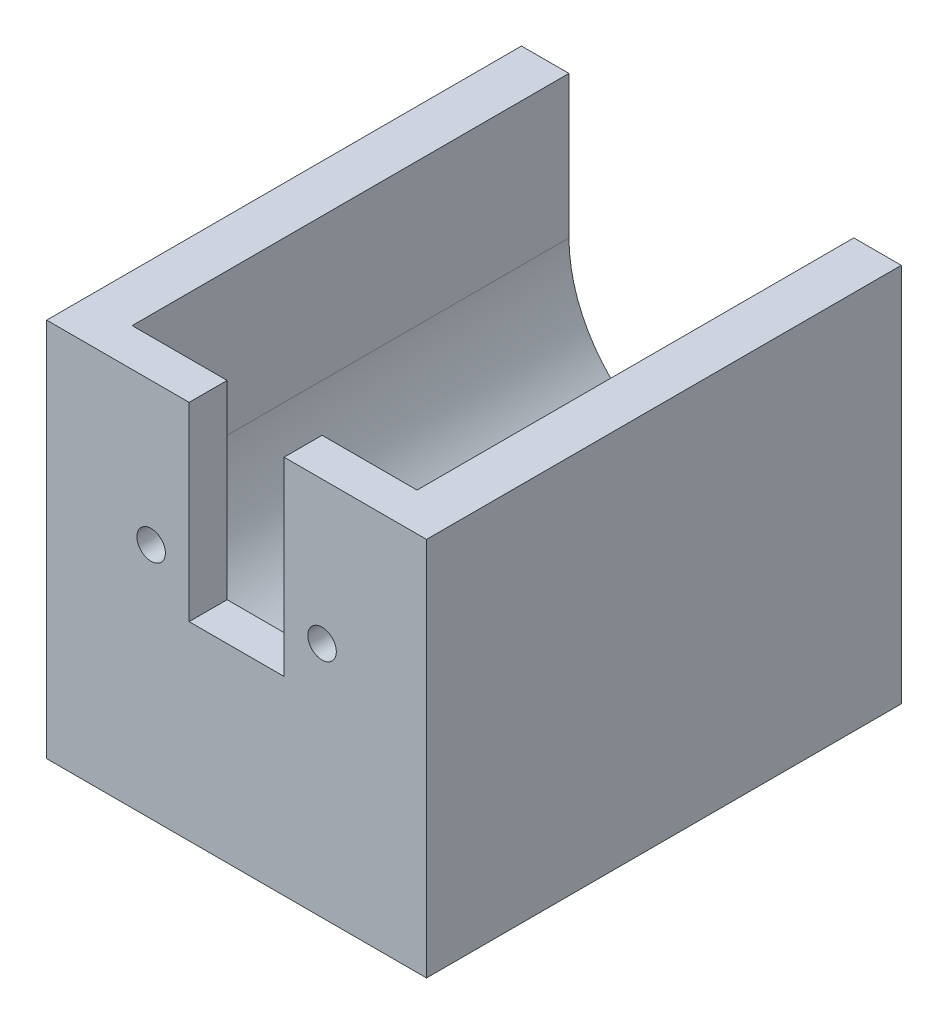
ISO-10303-21;
HEADER;
FILE_DESCRIPTION(('STEP AP214'),'2;1');
FILE_NAME('part.step','',(''),(''),'','','');
FILE_SCHEMA(('AUTOMOTIVE_DESIGN { 1 0 10303 214 1 1 1 1 }'));
ENDSEC;
DATA;
#1=APPLICATION_CONTEXT('core data for automotive mechanical design processes');
#2=APPLICATION_PROTOCOL_DEFINITION('international standard','automotive_design',2000,#1);
#3=PRODUCT_CONTEXT('',#1,'mechanical');
#4=PRODUCT('Part','Part','',(#3));
#5=PRODUCT_RELATED_PRODUCT_CATEGORY('part','',(#4));
#6=PRODUCT_DEFINITION_FORMATION('','',#4);
#7=PRODUCT_DEFINITION_CONTEXT('part definition',#1,'design');
#8=PRODUCT_DEFINITION('design','',#6,#7);
#9=PRODUCT_DEFINITION_SHAPE('','',#8);
#10=(LENGTH_UNIT() NAMED_UNIT(*) SI_UNIT(.MILLI.,.METRE.));
#11=(NAMED_UNIT(*) PLANE_ANGLE_UNIT() SI_UNIT($,.RADIAN.));
#12=(NAMED_UNIT(*) SI_UNIT($,.STERADIAN.) SOLID_ANGLE_UNIT());
#13=UNCERTAINTY_MEASURE_WITH_UNIT(LENGTH_MEASURE(1.E-05),#10,'distance_accuracy_value','');
#14=(GEOMETRIC_REPRESENTATION_CONTEXT(3) GLOBAL_UNCERTAINTY_ASSIGNED_CONTEXT((#13)) GLOBAL_UNIT_ASSIGNED_CONTEXT((#10,
#11,#12)) REPRESENTATION_CONTEXT('',''));
#15=CARTESIAN_POINT('',(0.,0.,0.));
#16=DIRECTION('',(0.,0.,1.));
#17=DIRECTION('',(1.,0.,0.));
#18=AXIS2_PLACEMENT_3D('',#15,#16,#17);
#19=CARTESIAN_POINT('',(10.,12.5,-32.));
#20=DIRECTION('',(0.,0.,1.));
#21=DIRECTION('',(1.,0.,0.));
#22=AXIS2_PLACEMENT_3D('',#19,#20,#21);
#23=CYLINDRICAL_SURFACE('',#22,7.5);
#24=CARTESIAN_POINT('',(10.,5.,-16.));
#25=CARTESIAN_POINT('',(9.91933679906047,5.00000111029528,-16.0000016109771));
#26=CARTESIAN_POINT('',(9.83864558650163,5.0013063104993,-16.00325988452));
#27=CARTESIAN_POINT('',(9.67785390547775,5.00648813823474,-16.0162529045329));
#28=CARTESIAN_POINT('',(9.59775384201802,5.01036638825381,-16.0259917374599));
#29=CARTESIAN_POINT('',(9.35890321893255,5.02575365191243,-16.0648711401178));
#30=CARTESIAN_POINT('',(9.20184191747828,5.04101477733758,-16.1036743075448));
#31=CARTESIAN_POINT('',(8.89752966100119,5.07988540873016,-16.2053142278109));
#32=CARTESIAN_POINT('',(8.75024842246924,5.10346756470325,-16.2680722990302));
#33=CARTESIAN_POINT('',(8.46840262594203,5.1566512277593,-16.415528730295));
#34=CARTESIAN_POINT('',(8.33383367572509,5.18625064459534,-16.5002194742658));
#35=CARTESIAN_POINT('',(8.07474547367278,5.25003659640635,-16.6933532563024));
#36=CARTESIAN_POINT('',(7.95090578196832,5.2843655162606,-16.8026599866313));
#37=CARTESIAN_POINT('',(7.72273830242395,5.35309137622315,-17.0401000029431));
#38=CARTESIAN_POINT('',(7.61842006058024,5.38748834134079,-17.1682424451965));
#39=CARTESIAN_POINT('',(7.4276879179321,5.45415811453267,-17.4466421060122));
#40=CARTESIAN_POINT('',(7.34227746638662,5.48626825825615,-17.5976297292088));
#41=CARTESIAN_POINT('',(7.19836798323504,5.54249529446661,-17.9133045974561));
#42=CARTESIAN_POINT('',(7.13985616976676,5.56661598190703,-18.0779852917251));
#43=CARTESIAN_POINT('',(7.05415174944522,5.6026046345439,-18.4085685004335));
#44=CARTESIAN_POINT('',(7.025659047163,5.61497869460735,-18.5740768533829));
#45=CARTESIAN_POINT('',(6.99674056166646,5.62753993932139,-18.9079524974424));
#46=CARTESIAN_POINT('',(6.99630097658633,5.62773311684932,-19.0763183419086));
#47=CARTESIAN_POINT('',(7.02251594776144,5.61634249608732,-19.3986350072253));
#48=CARTESIAN_POINT('',(7.04728702832417,5.60557737558287,-19.5527735717239));
#49=CARTESIAN_POINT('',(7.12007967986763,5.57485718705799,-19.8544893341131));
#50=CARTESIAN_POINT('',(7.16810530787593,5.55490051549373,-20.0020653821892));
#51=CARTESIAN_POINT('',(7.28695790108488,5.50760772334829,-20.2900267542603));
#52=CARTESIAN_POINT('',(7.35823020650324,5.4801293107012,-20.430203858573));
#53=CARTESIAN_POINT('',(7.52124030892547,5.42092825423867,-20.6971237245514));
#54=CARTESIAN_POINT('',(7.61298579235533,5.38920401817139,-20.8238614141067));
#55=CARTESIAN_POINT('',(7.82267410081125,5.32209894883995,-21.0706145932003));
#56=CARTESIAN_POINT('',(7.94209380554214,5.28662502535076,-21.1893530941683));
#57=CARTESIAN_POINT('',(8.19952835885662,5.21810262563274,-21.4055267170038));
#58=CARTESIAN_POINT('',(8.33754690199887,5.18505463332201,-21.5029575961156));
#59=CARTESIAN_POINT('',(8.63188352109071,5.12427978102985,-21.6754261711236));
#60=CARTESIAN_POINT('',(8.78850926298015,5.09667094856827,-21.7499834217955));
#61=CARTESIAN_POINT('',(9.11346435177582,5.05077757506913,-21.8712517916171));
#62=CARTESIAN_POINT('',(9.28178770472552,5.0324882980644,-21.9179770563361));
#63=CARTESIAN_POINT('',(9.61465616858824,5.00815790739621,-21.9796724431295));
#64=CARTESIAN_POINT('',(9.77883505902171,5.00145581249726,-21.9963586813803));
#65=CARTESIAN_POINT('',(10.1077679647117,4.99897282234057,-22.0025696507929));
#66=CARTESIAN_POINT('',(10.2725218198358,5.00318909626563,-21.9921014223213));
#67=CARTESIAN_POINT('',(10.590149108683,5.0216364940437,-21.945562371172));
#68=CARTESIAN_POINT('',(10.7432237376634,5.03540912981717,-21.9106630294736));
#69=CARTESIAN_POINT('',(11.0412031420909,5.07110837891748,-21.8178464375352));
#70=CARTESIAN_POINT('',(11.1861068653364,5.09303603965197,-21.7599262304967));
#71=CARTESIAN_POINT('',(11.4686181787259,5.1437510784379,-21.6208225904804));
#72=CARTESIAN_POINT('',(11.6058670341364,5.17272776030323,-21.5389817919364));
#73=CARTESIAN_POINT('',(11.8651653868666,5.23439952881684,-21.3550895141405));
#74=CARTESIAN_POINT('',(11.9872087611294,5.26709610334487,-21.253029935612));
#75=CARTESIAN_POINT('',(12.2210845645563,5.33532323542947,-21.0236949805799));
#76=CARTESIAN_POINT('',(12.3317109007594,5.37089837862861,-20.8951996877573));
#77=CARTESIAN_POINT('',(12.5301267960703,5.43887490623863,-20.6208398754693));
#78=CARTESIAN_POINT('',(12.6179125918181,5.47127576708592,-20.4749724994279));
#79=CARTESIAN_POINT('',(12.7687112530874,5.52928550140095,-20.1678074581716));
#80=CARTESIAN_POINT('',(12.831475892514,5.55482553679034,-20.006374001417));
#81=CARTESIAN_POINT('',(12.9284443288462,5.59514489776892,-19.673899522192));
#82=CARTESIAN_POINT('',(12.9626692052475,5.60993216432824,-19.5028656904034));
#83=CARTESIAN_POINT('',(12.9995734283829,5.62592361071621,-19.169308148153));
#84=CARTESIAN_POINT('',(13.0043456323476,5.62802868565341,-19.0070577435492));
#85=CARTESIAN_POINT('',(12.9877047300241,5.62077745872765,-18.6841827104912));
#86=CARTESIAN_POINT('',(12.9662949487688,5.61142261223981,-18.5235578782059));
#87=CARTESIAN_POINT('',(12.8996070810233,5.58310026658875,-18.215001725725));
#88=CARTESIAN_POINT('',(12.8553063568106,5.56452753274938,-18.0668196268388));
#89=CARTESIAN_POINT('',(12.7450080562502,5.52013997134562,-17.7799320170809));
#90=CARTESIAN_POINT('',(12.6790044878915,5.49432314402415,-17.6412291361468));
#91=CARTESIAN_POINT('',(12.5228096031995,5.43652089598758,-17.3685857228138));
#92=CARTESIAN_POINT('',(12.4314497613399,5.40426691874683,-17.2353725760242));
#93=CARTESIAN_POINT('',(12.2288364197758,5.33804278092467,-16.985509442799));
#94=CARTESIAN_POINT('',(12.1175769239766,5.3040721052933,-16.8688644676868));
#95=CARTESIAN_POINT('',(11.8697652641623,5.23559710488391,-16.6476980351852));
#96=CARTESIAN_POINT('',(11.7320409344105,5.20120098056014,-16.5444529409441));
#97=CARTESIAN_POINT('',(11.4398235352366,5.13799154821058,-16.3624855306449));
#98=CARTESIAN_POINT('',(11.2853227122971,5.10918083885154,-16.2837746190438));
#99=CARTESIAN_POINT('',(11.0458904629238,5.07285172113922,-16.1869264991112));
#100=CARTESIAN_POINT('',(10.9655506423263,5.061957476294,-16.158344029876));
#101=CARTESIAN_POINT('',(10.8024720151951,5.04260376205747,-16.1080623417057));
#102=CARTESIAN_POINT('',(10.7197343470038,5.03414315751714,-16.0863599131552));
#103=CARTESIAN_POINT('',(10.5527075558774,5.01992456499654,-16.0501179690362));
#104=CARTESIAN_POINT('',(10.468422937873,5.01415972591675,-16.0355602908621));
#105=CARTESIAN_POINT('',(10.2988146089412,5.00547490593684,-16.0136963472085));
#106=CARTESIAN_POINT('',(10.2134916803117,5.00255290306599,-16.0063849277493));
#107=CARTESIAN_POINT('',(10.0853730051866,5.00036409779144,-16.0009104795947));
#108=CARTESIAN_POINT('',(10.0426904255931,4.99999941238412,-15.9999991474018));
#109=CARTESIAN_POINT('',(10.,5.,-16.));
#110=B_SPLINE_CURVE_WITH_KNOTS('',3,(#24,#25,#26,#27,#28,#29,#30,#31,#32,#33,#34,#35,#36,#37,
#38,#39,#40,#41,#42,#43,#44,#45,#46,#47,#48,#49,#50,#51,#52,#53,#54,#55,#56,#57,#58,#59,#60,#61,
#62,#63,#64,#65,#66,#67,#68,#69,#70,#71,#72,#73,#74,#75,#76,#77,#78,#79,#80,#81,#82,#83,#84,#85,
#86,#87,#88,#89,#90,#91,#92,#93,#94,#95,#96,#97,#98,#99,#100,#101,#102,#103,#104,#105,#106,#107,
#108,#109),.UNSPECIFIED.,.T.,.F.,(4,2,2,2,2,2,2,2,2,2,2,2,2,2,2,2,2,2,2,2,2,2,2,2,2,2,2,2,2,2,2,
2,2,2,2,2,2,2,2,2,2,2,4),(0.,0.241952995066615,0.484058703589862,0.968979675762158,
1.45232140795763,1.93549552527002,2.43941494725621,2.94358014576643,3.47018310403851,
3.99653556852428,4.49901580138268,5.00124881685757,5.46852914780512,5.93589103065597,
6.41279111629751,6.88987055088802,7.40382945961362,7.91789061441126,8.44210791925736,
8.96605856352212,9.45899198973538,9.9517976253665,10.4224610552807,10.8931849567222,
11.3783069227892,11.8636236142998,12.3809813411815,12.8984242574715,13.4208798989277,
13.9429493115043,14.4274493227065,14.911887810261,15.3771690000468,15.8425787588927,
16.3346362426657,16.8268422420412,17.3509605748228,17.8753221764233,18.1329380344125,
18.3904335342851,18.6472710222664,18.9039257004315,19.0319776028183),.UNSPECIFIED.);
#111=CARTESIAN_POINT('',(10.,5.,-16.));
#112=VERTEX_POINT('',#111);
#113=EDGE_CURVE('E179',#112,#112,#110,.T.);
#114=ORIENTED_EDGE('',*,*,#113,.T.);
#115=EDGE_LOOP('',(#114));
#116=FACE_BOUND('',#115,.T.);
#117=CARTESIAN_POINT('',(10.,5.,-7.));
#118=CARTESIAN_POINT('',(9.91933679906047,5.00000111029528,-7.0000016109771));
#119=CARTESIAN_POINT('',(9.83864558650163,5.0013063104993,-7.00325988452));
#120=CARTESIAN_POINT('',(9.67785390547775,5.00648813823474,-7.0162529045329));
#121=CARTESIAN_POINT('',(9.59775384201802,5.01036638825381,-7.02599173745989));
#122=CARTESIAN_POINT('',(9.35890321893255,5.02575365191243,-7.0648711401178));
#123=CARTESIAN_POINT('',(9.20184191747828,5.04101477733758,-7.10367430754479));
#124=CARTESIAN_POINT('',(8.8975296610012,5.07988540873016,-7.2053142278109));
#125=CARTESIAN_POINT('',(8.75024842246924,5.10346756470325,-7.26807229903017));
#126=CARTESIAN_POINT('',(8.46840262594204,5.1566512277593,-7.41552873029505));
#127=CARTESIAN_POINT('',(8.33383367572509,5.18625064459534,-7.50021947426577));
#128=CARTESIAN_POINT('',(8.07474547367278,5.25003659640635,-7.69335325630236));
#129=CARTESIAN_POINT('',(7.95090578196832,5.2843655162606,-7.80265998663132));
#130=CARTESIAN_POINT('',(7.72273830242395,5.35309137622316,-8.04010000294314));
#131=CARTESIAN_POINT('',(7.61842006058024,5.38748834134079,-8.1682424451965));
#132=CARTESIAN_POINT('',(7.4276879179321,5.45415811453267,-8.44664210601216));
#133=CARTESIAN_POINT('',(7.34227746638662,5.48626825825615,-8.59762972920882));
#134=CARTESIAN_POINT('',(7.19836798323504,5.54249529446661,-8.91330459745613));
#135=CARTESIAN_POINT('',(7.13985616976676,5.56661598190702,-9.0779852917251));
#136=CARTESIAN_POINT('',(7.05415174944522,5.6026046345439,-9.40856850043345));
#137=CARTESIAN_POINT('',(7.025659047163,5.61497869460735,-9.57407685338287));
#138=CARTESIAN_POINT('',(6.99674056166645,5.62753993932139,-9.90795249744237));
#139=CARTESIAN_POINT('',(6.99630097658633,5.62773311684932,-10.0763183419086));
#140=CARTESIAN_POINT('',(7.02251594776144,5.61634249608732,-10.3986350072253));
#141=CARTESIAN_POINT('',(7.04728702832417,5.60557737558286,-10.5527735717239));
#142=CARTESIAN_POINT('',(7.12007967986763,5.57485718705798,-10.8544893341131));
#143=CARTESIAN_POINT('',(7.16810530787593,5.55490051549373,-11.0020653821892));
#144=CARTESIAN_POINT('',(7.28695790108488,5.50760772334829,-11.2900267542603));
#145=CARTESIAN_POINT('',(7.35823020650324,5.4801293107012,-11.430203858573));
#146=CARTESIAN_POINT('',(7.52124030892547,5.42092825423867,-11.6971237245514));
#147=CARTESIAN_POINT('',(7.61298579235533,5.38920401817139,-11.8238614141067));
#148=CARTESIAN_POINT('',(7.82267410081124,5.32209894883995,-12.0706145932003));
#149=CARTESIAN_POINT('',(7.94209380554214,5.28662502535076,-12.1893530941683));
#150=CARTESIAN_POINT('',(8.19952835885662,5.21810262563274,-12.4055267170038));
#151=CARTESIAN_POINT('',(8.33754690199886,5.18505463332201,-12.5029575961156));
#152=CARTESIAN_POINT('',(8.63188352109071,5.12427978102985,-12.6754261711236));
#153=CARTESIAN_POINT('',(8.78850926298014,5.09667094856827,-12.7499834217955));
#154=CARTESIAN_POINT('',(9.11346435177581,5.05077757506913,-12.8712517916171));
#155=CARTESIAN_POINT('',(9.28178770472552,5.0324882980644,-12.9179770563361));
#156=CARTESIAN_POINT('',(9.61465616858824,5.00815790739621,-12.9796724431296));
#157=CARTESIAN_POINT('',(9.77883505902171,5.00145581249726,-12.9963586813803));
#158=CARTESIAN_POINT('',(10.1077679647117,4.99897282234057,-13.0025696507929));
#159=CARTESIAN_POINT('',(10.2725218198358,5.00318909626563,-12.9921014223212));
#160=CARTESIAN_POINT('',(10.590149108683,5.0216364940437,-12.945562371172));
#161=CARTESIAN_POINT('',(10.7432237376634,5.03540912981717,-12.9106630294736));
#162=CARTESIAN_POINT('',(11.0412031420909,5.07110837891748,-12.8178464375352));
#163=CARTESIAN_POINT('',(11.1861068653364,5.09303603965197,-12.7599262304967));
#164=CARTESIAN_POINT('',(11.4686181787259,5.1437510784379,-12.6208225904804));
#165=CARTESIAN_POINT('',(11.6058670341364,5.17272776030323,-12.5389817919364));
#166=CARTESIAN_POINT('',(11.8651653868666,5.23439952881684,-12.3550895141405));
#167=CARTESIAN_POINT('',(11.9872087611294,5.26709610334487,-12.253029935612));
#168=CARTESIAN_POINT('',(12.2210845645563,5.33532323542946,-12.0236949805799));
#169=CARTESIAN_POINT('',(12.3317109007594,5.37089837862861,-11.8951996877573));
#170=CARTESIAN_POINT('',(12.5301267960703,5.43887490623863,-11.6208398754693));
#171=CARTESIAN_POINT('',(12.6179125918181,5.47127576708592,-11.4749724994279));
#172=CARTESIAN_POINT('',(12.7687112530874,5.52928550140095,-11.1678074581716));
#173=CARTESIAN_POINT('',(12.831475892514,5.55482553679034,-11.006374001417));
#174=CARTESIAN_POINT('',(12.9284443288462,5.59514489776892,-10.673899522192));
#175=CARTESIAN_POINT('',(12.9626692052475,5.60993216432824,-10.5028656904034));
#176=CARTESIAN_POINT('',(12.9995734283829,5.62592361071621,-10.169308148153));
#177=CARTESIAN_POINT('',(13.0043456323476,5.62802868565341,-10.0070577435492));
#178=CARTESIAN_POINT('',(12.9877047300241,5.62077745872765,-9.68418271049118));
#179=CARTESIAN_POINT('',(12.9662949487688,5.61142261223982,-9.52355787820591));
#180=CARTESIAN_POINT('',(12.8996070810233,5.58310026658875,-9.21500172572503));
#181=CARTESIAN_POINT('',(12.8553063568106,5.56452753274938,-9.06681962683876));
#182=CARTESIAN_POINT('',(12.7450080562502,5.52013997134562,-8.7799320170809));
#183=CARTESIAN_POINT('',(12.6790044878915,5.49432314402415,-8.64122913614684));
#184=CARTESIAN_POINT('',(12.5228096031995,5.43652089598758,-8.36858572281377));
#185=CARTESIAN_POINT('',(12.4314497613399,5.40426691874683,-8.23537257602419));
#186=CARTESIAN_POINT('',(12.2288364197758,5.33804278092467,-7.98550944279904));
#187=CARTESIAN_POINT('',(12.1175769239766,5.3040721052933,-7.86886446768675));
#188=CARTESIAN_POINT('',(11.8697652641623,5.23559710488391,-7.64769803518518));
#189=CARTESIAN_POINT('',(11.7320409344105,5.20120098056014,-7.54445294094406));
#190=CARTESIAN_POINT('',(11.4398235352366,5.13799154821058,-7.36248553064487));
#191=CARTESIAN_POINT('',(11.2853227122971,5.10918083885155,-7.28377461904378));
#192=CARTESIAN_POINT('',(11.0458904629238,5.07285172113922,-7.18692649911122));
#193=CARTESIAN_POINT('',(10.9655506423263,5.061957476294,-7.158344029876));
#194=CARTESIAN_POINT('',(10.8024720151951,5.04260376205747,-7.10806234170568));
#195=CARTESIAN_POINT('',(10.7197343470038,5.03414315751714,-7.08635991315522));
#196=CARTESIAN_POINT('',(10.5527075558774,5.01992456499654,-7.05011796903623));
#197=CARTESIAN_POINT('',(10.468422937873,5.01415972591675,-7.0355602908621));
#198=CARTESIAN_POINT('',(10.2988146089412,5.00547490593684,-7.01369634720849));
#199=CARTESIAN_POINT('',(10.2134916803117,5.00255290306599,-7.00638492774934));
#200=CARTESIAN_POINT('',(10.0853730051866,5.00036409779144,-7.00091047959473));
#201=CARTESIAN_POINT('',(10.0426904255931,4.99999941238412,-6.99999914740183));
#202=CARTESIAN_POINT('',(10.,5.,-7.));
#203=B_SPLINE_CURVE_WITH_KNOTS('',3,(#117,#118,#119,#120,#121,#122,#123,#124,#125,#126,#127,
#128,#129,#130,#131,#132,#133,#134,#135,#136,#137,#138,#139,#140,#141,#142,#143,#144,#145,#146,
#147,#148,#149,#150,#151,#152,#153,#154,#155,#156,#157,#158,#159,#160,#161,#162,#163,#164,#165,
#166,#167,#168,#169,#170,#171,#172,#173,#174,#175,#176,#177,#178,#179,#180,#181,#182,#183,#184,
#185,#186,#187,#188,#189,#190,#191,#192,#193,#194,#195,#196,#197,#198,#199,#200,#201,#202),
.UNSPECIFIED.,.T.,.F.,(4,2,2,2,2,2,2,2,2,2,2,2,2,2,2,2,2,2,2,2,2,2,2,2,2,2,2,2,2,2,2,2,2,2,2,2,
2,2,2,2,2,2,4),(0.,0.241952995066615,0.484058703589862,0.968979675762156,1.45232140795762,
1.93549552527002,2.43941494725621,2.94358014576643,3.47018310403851,3.99653556852427,
4.49901580138268,5.00124881685757,5.46852914780512,5.93589103065598,6.4127911162975,
6.88987055088801,7.40382945961362,7.91789061441126,8.44210791925736,8.96605856352212,
9.45899198973537,9.95179762536649,10.4224610552807,10.8931849567222,11.3783069227892,
11.8636236142998,12.3809813411815,12.8984242574715,13.4208798989277,13.9429493115043,
14.4274493227065,14.9118878102609,15.3771690000468,15.8425787588927,16.3346362426656,
16.8268422420412,17.3509605748228,17.8753221764233,18.1329380344125,18.3904335342851,
18.6472710222664,18.9039257004315,19.0319776028183),.UNSPECIFIED.);
#204=CARTESIAN_POINT('',(10.,5.,-7.));
#205=VERTEX_POINT('',#204);
#206=EDGE_CURVE('E188',#205,#205,#203,.T.);
#207=ORIENTED_EDGE('',*,*,#206,.T.);
#208=EDGE_LOOP('',(#207));
#209=FACE_BOUND('',#208,.T.);
#210=CARTESIAN_POINT('',(10.,12.5,-2.));
#211=DIRECTION('',(0.,0.,1.));
#212=DIRECTION('',(1.,0.,0.));
#213=AXIS2_PLACEMENT_3D('',#210,#211,#212);
#214=CIRCLE('',#213,7.5);
#215=CARTESIAN_POINT('',(17.5,12.5,-2.));
#216=VERTEX_POINT('',#215);
#217=CARTESIAN_POINT('',(2.5,12.5,-2.));
#218=VERTEX_POINT('',#217);
#219=EDGE_CURVE('E169',#216,#218,#214,.F.);
#220=ORIENTED_EDGE('',*,*,#219,.F.);
#221=DIRECTION('',(0.,0.,1.));
#222=VECTOR('',#221,1.);
#223=CARTESIAN_POINT('',(17.5,12.5,-32.));
#224=LINE('',#223,#222);
#225=CARTESIAN_POINT('',(17.5,12.5,-25.));
#226=VERTEX_POINT('',#225);
#227=EDGE_CURVE('E185',#226,#216,#224,.T.);
#228=ORIENTED_EDGE('',*,*,#227,.F.);
#229=CARTESIAN_POINT('',(10.,12.5,-25.));
#230=DIRECTION('',(0.,0.,1.));
#231=DIRECTION('',(1.,0.,0.));
#232=AXIS2_PLACEMENT_3D('',#229,#230,#231);
#233=CIRCLE('',#232,7.5);
#234=CARTESIAN_POINT('',(2.5,12.5,-25.));
#235=VERTEX_POINT('',#234);
#236=EDGE_CURVE('E42',#235,#226,#233,.T.);
#237=ORIENTED_EDGE('',*,*,#236,.F.);
#238=DIRECTION('',(0.,0.,1.));
#239=VECTOR('',#238,1.);
#240=CARTESIAN_POINT('',(2.5,12.5,-32.));
#241=LINE('',#240,#239);
#242=EDGE_CURVE('E182',#235,#218,#241,.T.);
#243=ORIENTED_EDGE('',*,*,#242,.T.);
#244=EDGE_LOOP('',(#220,#228,#237,#243));
#245=FACE_BOUND('',#244,.T.);
#246=ADVANCED_FACE('F33',(#116,#209,#245),#23,.F.);
#247=CARTESIAN_POINT('',(2.5,12.5,-32.));
#248=DIRECTION('',(-1.,0.,0.));
#249=DIRECTION('',(0.,0.,1.));
#250=AXIS2_PLACEMENT_3D('',#247,#248,#249);
#251=PLANE('',#250);
#252=DIRECTION('',(0.,1.,0.));
#253=VECTOR('',#252,1.);
#254=CARTESIAN_POINT('',(2.5,12.5,-2.));
#255=LINE('',#254,#253);
#256=CARTESIAN_POINT('',(2.5,20.,-2.));
#257=VERTEX_POINT('',#256);
#258=EDGE_CURVE('E50',#218,#257,#255,.T.);
#259=ORIENTED_EDGE('',*,*,#258,.F.);
#260=ORIENTED_EDGE('',*,*,#242,.F.);
#261=DIRECTION('',(0.,-1.,0.));
#262=VECTOR('',#261,1.);
#263=CARTESIAN_POINT('',(2.5,20.,-25.));
#264=LINE('',#263,#262);
#265=CARTESIAN_POINT('',(2.5,20.,-25.));
#266=VERTEX_POINT('',#265);
#267=EDGE_CURVE('E191',#266,#235,#264,.T.);
#268=ORIENTED_EDGE('',*,*,#267,.F.);
#269=DIRECTION('',(0.,0.,-1.));
#270=VECTOR('',#269,1.);
#271=CARTESIAN_POINT('',(2.5,20.,0.));
#272=LINE('',#271,#270);
#273=EDGE_CURVE('E55',#257,#266,#272,.T.);
#274=ORIENTED_EDGE('',*,*,#273,.F.);
#275=EDGE_LOOP('',(#259,#260,#268,#274));
#276=FACE_BOUND('',#275,.T.);
#277=ADVANCED_FACE('F248',(#276),#251,.F.);
#278=CARTESIAN_POINT('',(17.5,20.,-32.));
#279=DIRECTION('',(1.,0.,0.));
#280=DIRECTION('',(0.,0.,-1.));
#281=AXIS2_PLACEMENT_3D('',#278,#279,#280);
#282=PLANE('',#281);
#283=DIRECTION('',(0.,-1.,0.));
#284=VECTOR('',#283,1.);
#285=CARTESIAN_POINT('',(17.5,20.,-2.));
#286=LINE('',#285,#284);
#287=CARTESIAN_POINT('',(17.5,20.,-2.));
#288=VERTEX_POINT('',#287);
#289=EDGE_CURVE('E11',#288,#216,#286,.T.);
#290=ORIENTED_EDGE('',*,*,#289,.F.);
#291=DIRECTION('',(0.,0.,1.));
#292=VECTOR('',#291,1.);
#293=CARTESIAN_POINT('',(17.5,20.,0.));
#294=LINE('',#293,#292);
#295=CARTESIAN_POINT('',(17.5,20.,-25.));
#296=VERTEX_POINT('',#295);
#297=EDGE_CURVE('E130',#296,#288,#294,.T.);
#298=ORIENTED_EDGE('',*,*,#297,.F.);
#299=DIRECTION('',(0.,1.,0.));
#300=VECTOR('',#299,1.);
#301=CARTESIAN_POINT('',(17.5,20.,-25.));
#302=LINE('',#301,#300);
#303=EDGE_CURVE('E184',#226,#296,#302,.T.);
#304=ORIENTED_EDGE('',*,*,#303,.F.);
#305=ORIENTED_EDGE('',*,*,#227,.T.);
#306=EDGE_LOOP('',(#290,#298,#304,#305));
#307=FACE_BOUND('',#306,.T.);
#308=ADVANCED_FACE('F250',(#307),#282,.F.);
#309=CARTESIAN_POINT('',(0.,20.,0.));
#310=DIRECTION('',(0.,-1.,0.));
#311=DIRECTION('',(0.,0.,-1.));
#312=AXIS2_PLACEMENT_3D('',#309,#310,#311);
#313=PLANE('',#312);
#314=DIRECTION('',(1.,0.,0.));
#315=VECTOR('',#314,1.);
#316=CARTESIAN_POINT('',(0.,20.,0.));
#317=LINE('',#316,#315);
#318=CARTESIAN_POINT('',(0.,20.,0.));
#319=VERTEX_POINT('',#318);
#320=CARTESIAN_POINT('',(7.5,20.,0.));
#321=VERTEX_POINT('',#320);
#322=EDGE_CURVE('E199',#319,#321,#317,.T.);
#323=ORIENTED_EDGE('',*,*,#322,.T.);
#324=DIRECTION('',(0.,0.,1.));
#325=VECTOR('',#324,1.);
#326=CARTESIAN_POINT('',(7.5,20.,-2.));
#327=LINE('',#326,#325);
#328=CARTESIAN_POINT('',(7.5,20.,-2.));
#329=VERTEX_POINT('',#328);
#330=EDGE_CURVE('E166',#329,#321,#327,.T.);
#331=ORIENTED_EDGE('',*,*,#330,.F.);
#332=DIRECTION('',(-1.,0.,0.));
#333=VECTOR('',#332,1.);
#334=CARTESIAN_POINT('',(0.,20.,-2.));
#335=LINE('',#334,#333);
#336=EDGE_CURVE('E142',#329,#257,#335,.T.);
#337=ORIENTED_EDGE('',*,*,#336,.T.);
#338=ORIENTED_EDGE('',*,*,#273,.T.);
#339=DIRECTION('',(-1.,0.,0.));
#340=VECTOR('',#339,1.);
#341=CARTESIAN_POINT('',(0.,20.,-25.));
#342=LINE('',#341,#340);
#343=CARTESIAN_POINT('',(0.,20.,-25.));
#344=VERTEX_POINT('',#343);
#345=EDGE_CURVE('E203',#266,#344,#342,.T.);
#346=ORIENTED_EDGE('',*,*,#345,.T.);
#347=DIRECTION('',(0.,0.,1.));
#348=VECTOR('',#347,1.);
#349=CARTESIAN_POINT('',(0.,20.,0.));
#350=LINE('',#349,#348);
#351=EDGE_CURVE('E195',#344,#319,#350,.T.);
#352=ORIENTED_EDGE('',*,*,#351,.T.);
#353=EDGE_LOOP('',(#323,#331,#337,#338,#346,#352));
#354=FACE_BOUND('',#353,.T.);
#355=ADVANCED_FACE('F252',(#354),#313,.F.);
#356=CARTESIAN_POINT('',(0.,20.,0.));
#357=DIRECTION('',(1.,0.,0.));
#358=DIRECTION('',(0.,0.,-1.));
#359=AXIS2_PLACEMENT_3D('',#356,#357,#358);
#360=PLANE('',#359);
#361=DIRECTION('',(0.,-1.,0.));
#362=VECTOR('',#361,1.);
#363=CARTESIAN_POINT('',(0.,20.,0.));
#364=LINE('',#363,#362);
#365=CARTESIAN_POINT('',(0.,0.,0.));
#366=VERTEX_POINT('',#365);
#367=EDGE_CURVE('E221',#319,#366,#364,.T.);
#368=ORIENTED_EDGE('',*,*,#367,.F.);
#369=ORIENTED_EDGE('',*,*,#351,.F.);
#370=DIRECTION('',(0.,-1.,0.));
#371=VECTOR('',#370,1.);
#372=CARTESIAN_POINT('',(0.,20.,-25.));
#373=LINE('',#372,#371);
#374=CARTESIAN_POINT('',(0.,0.,-25.));
#375=VERTEX_POINT('',#374);
#376=EDGE_CURVE('E206',#344,#375,#373,.T.);
#377=ORIENTED_EDGE('',*,*,#376,.T.);
#378=DIRECTION('',(0.,0.,1.));
#379=VECTOR('',#378,1.);
#380=CARTESIAN_POINT('',(0.,0.,0.));
#381=LINE('',#380,#379);
#382=EDGE_CURVE('E194',#375,#366,#381,.T.);
#383=ORIENTED_EDGE('',*,*,#382,.T.);
#384=EDGE_LOOP('',(#368,#369,#377,#383));
#385=FACE_BOUND('',#384,.T.);
#386=ADVANCED_FACE('F35',(#385),#360,.F.);
#387=CARTESIAN_POINT('',(0.,20.,0.));
#388=DIRECTION('',(0.,0.,-1.));
#389=DIRECTION('',(-1.,0.,0.));
#390=AXIS2_PLACEMENT_3D('',#387,#388,#389);
#391=PLANE('',#390);
#392=CARTESIAN_POINT('',(14.5,12.5,0.));
#393=DIRECTION('',(0.,0.,-1.));
#394=DIRECTION('',(-1.,0.,0.));
#395=AXIS2_PLACEMENT_3D('',#392,#393,#394);
#396=CIRCLE('',#395,0.750000000000002);
#397=CARTESIAN_POINT('',(13.75,12.5,0.));
#398=VERTEX_POINT('',#397);
#399=EDGE_CURVE('E161',#398,#398,#396,.T.);
#400=ORIENTED_EDGE('',*,*,#399,.T.);
#401=EDGE_LOOP('',(#400));
#402=FACE_BOUND('',#401,.T.);
#403=CARTESIAN_POINT('',(5.5,12.5,0.));
#404=DIRECTION('',(0.,0.,-1.));
#405=DIRECTION('',(-1.,0.,0.));
#406=AXIS2_PLACEMENT_3D('',#403,#404,#405);
#407=CIRCLE('',#406,0.75);
#408=CARTESIAN_POINT('',(4.75,12.5,0.));
#409=VERTEX_POINT('',#408);
#410=EDGE_CURVE('E466',#409,#409,#407,.T.);
#411=ORIENTED_EDGE('',*,*,#410,.T.);
#412=EDGE_LOOP('',(#411));
#413=FACE_BOUND('',#412,.T.);
#414=DIRECTION('',(0.,1.,0.));
#415=VECTOR('',#414,1.);
#416=CARTESIAN_POINT('',(7.5,10.,0.));
#417=LINE('',#416,#415);
#418=CARTESIAN_POINT('',(7.5,10.,0.));
#419=VERTEX_POINT('',#418);
#420=EDGE_CURVE('E134',#419,#321,#417,.T.);
#421=ORIENTED_EDGE('',*,*,#420,.T.);
#422=ORIENTED_EDGE('',*,*,#322,.F.);
#423=ORIENTED_EDGE('',*,*,#367,.T.);
#424=DIRECTION('',(1.,0.,0.));
#425=VECTOR('',#424,1.);
#426=CARTESIAN_POINT('',(0.,0.,0.));
#427=LINE('',#426,#425);
#428=CARTESIAN_POINT('',(20.,0.,0.));
#429=VERTEX_POINT('',#428);
#430=EDGE_CURVE('E208',#366,#429,#427,.T.);
#431=ORIENTED_EDGE('',*,*,#430,.T.);
#432=DIRECTION('',(0.,-1.,0.));
#433=VECTOR('',#432,1.);
#434=CARTESIAN_POINT('',(20.,20.,0.));
#435=LINE('',#434,#433);
#436=CARTESIAN_POINT('',(20.,20.,0.));
#437=VERTEX_POINT('',#436);
#438=EDGE_CURVE('E218',#437,#429,#435,.T.);
#439=ORIENTED_EDGE('',*,*,#438,.F.);
#440=CARTESIAN_POINT('',(12.5,20.,0.));
#441=VERTEX_POINT('',#440);
#442=EDGE_CURVE('E197',#441,#437,#317,.T.);
#443=ORIENTED_EDGE('',*,*,#442,.F.);
#444=DIRECTION('',(0.,-1.,0.));
#445=VECTOR('',#444,1.);
#446=CARTESIAN_POINT('',(12.5,10.,0.));
#447=LINE('',#446,#445);
#448=CARTESIAN_POINT('',(12.5,10.,0.));
#449=VERTEX_POINT('',#448);
#450=EDGE_CURVE('E140',#441,#449,#447,.T.);
#451=ORIENTED_EDGE('',*,*,#450,.T.);
#452=DIRECTION('',(-1.,0.,0.));
#453=VECTOR('',#452,1.);
#454=CARTESIAN_POINT('',(7.5,10.,0.));
#455=LINE('',#454,#453);
#456=EDGE_CURVE('E160',#449,#419,#455,.T.);
#457=ORIENTED_EDGE('',*,*,#456,.T.);
#458=EDGE_LOOP('',(#421,#422,#423,#431,#439,#443,#451,#457));
#459=FACE_BOUND('',#458,.T.);
#460=ADVANCED_FACE('F294',(#402,#413,#459),#391,.F.);
#461=CARTESIAN_POINT('',(20.,20.,0.));
#462=DIRECTION('',(-1.,0.,0.));
#463=DIRECTION('',(0.,0.,1.));
#464=AXIS2_PLACEMENT_3D('',#461,#462,#463);
#465=PLANE('',#464);
#466=DIRECTION('',(0.,0.,-1.));
#467=VECTOR('',#466,1.);
#468=CARTESIAN_POINT('',(20.,0.,0.));
#469=LINE('',#468,#467);
#470=CARTESIAN_POINT('',(20.,0.,-25.));
#471=VERTEX_POINT('',#470);
#472=EDGE_CURVE('E210',#429,#471,#469,.T.);
#473=ORIENTED_EDGE('',*,*,#472,.T.);
#474=DIRECTION('',(0.,-1.,0.));
#475=VECTOR('',#474,1.);
#476=CARTESIAN_POINT('',(20.,20.,-25.));
#477=LINE('',#476,#475);
#478=CARTESIAN_POINT('',(20.,20.,-25.));
#479=VERTEX_POINT('',#478);
#480=EDGE_CURVE('E215',#479,#471,#477,.T.);
#481=ORIENTED_EDGE('',*,*,#480,.F.);
#482=DIRECTION('',(0.,0.,-1.));
#483=VECTOR('',#482,1.);
#484=CARTESIAN_POINT('',(20.,20.,0.));
#485=LINE('',#484,#483);
#486=EDGE_CURVE('E201',#437,#479,#485,.T.);
#487=ORIENTED_EDGE('',*,*,#486,.F.);
#488=ORIENTED_EDGE('',*,*,#438,.T.);
#489=EDGE_LOOP('',(#473,#481,#487,#488));
#490=FACE_BOUND('',#489,.T.);
#491=ADVANCED_FACE('F276',(#490),#465,.F.);
#492=CARTESIAN_POINT('',(0.,20.,-25.));
#493=DIRECTION('',(0.,0.,1.));
#494=DIRECTION('',(1.,0.,0.));
#495=AXIS2_PLACEMENT_3D('',#492,#493,#494);
#496=PLANE('',#495);
#497=ORIENTED_EDGE('',*,*,#345,.F.);
#498=ORIENTED_EDGE('',*,*,#267,.T.);
#499=ORIENTED_EDGE('',*,*,#236,.T.);
#500=ORIENTED_EDGE('',*,*,#303,.T.);
#501=EDGE_CURVE('E204',#479,#296,#342,.T.);
#502=ORIENTED_EDGE('',*,*,#501,.F.);
#503=ORIENTED_EDGE('',*,*,#480,.T.);
#504=DIRECTION('',(-1.,0.,0.));
#505=VECTOR('',#504,1.);
#506=CARTESIAN_POINT('',(0.,0.,-25.));
#507=LINE('',#506,#505);
#508=EDGE_CURVE('E198',#471,#375,#507,.T.);
#509=ORIENTED_EDGE('',*,*,#508,.T.);
#510=ORIENTED_EDGE('',*,*,#376,.F.);
#511=EDGE_LOOP('',(#497,#498,#499,#500,#502,#503,#509,#510));
#512=FACE_BOUND('',#511,.T.);
#513=ADVANCED_FACE('F271',(#512),#496,.F.);
#514=ORIENTED_EDGE('',*,*,#486,.T.);
#515=ORIENTED_EDGE('',*,*,#501,.T.);
#516=ORIENTED_EDGE('',*,*,#297,.T.);
#517=DIRECTION('',(-1.,0.,0.));
#518=VECTOR('',#517,1.);
#519=CARTESIAN_POINT('',(12.5,20.,-2.));
#520=LINE('',#519,#518);
#521=CARTESIAN_POINT('',(12.5,20.,-2.));
#522=VERTEX_POINT('',#521);
#523=EDGE_CURVE('E124',#288,#522,#520,.T.);
#524=ORIENTED_EDGE('',*,*,#523,.T.);
#525=DIRECTION('',(0.,0.,1.));
#526=VECTOR('',#525,1.);
#527=CARTESIAN_POINT('',(12.5,20.,-2.));
#528=LINE('',#527,#526);
#529=EDGE_CURVE('E127',#522,#441,#528,.T.);
#530=ORIENTED_EDGE('',*,*,#529,.T.);
#531=ORIENTED_EDGE('',*,*,#442,.T.);
#532=EDGE_LOOP('',(#514,#515,#516,#524,#530,#531));
#533=FACE_BOUND('',#532,.T.);
#534=ADVANCED_FACE('F126',(#533),#313,.F.);
#535=CARTESIAN_POINT('',(0.,0.,0.));
#536=DIRECTION('',(0.,-1.,0.));
#537=DIRECTION('',(0.,0.,-1.));
#538=AXIS2_PLACEMENT_3D('',#535,#536,#537);
#539=PLANE('',#538);
#540=ORIENTED_EDGE('',*,*,#430,.F.);
#541=ORIENTED_EDGE('',*,*,#382,.F.);
#542=ORIENTED_EDGE('',*,*,#508,.F.);
#543=ORIENTED_EDGE('',*,*,#472,.F.);
#544=EDGE_LOOP('',(#540,#541,#542,#543));
#545=FACE_BOUND('',#544,.T.);
#546=ADVANCED_FACE('F246',(#545),#539,.T.);
#547=CARTESIAN_POINT('',(10.,3.00000000000001,-19.));
#548=DIRECTION('',(0.,1.,0.));
#549=DIRECTION('',(0.,0.,1.));
#550=AXIS2_PLACEMENT_3D('',#547,#548,#549);
#551=CYLINDRICAL_SURFACE('',#550,3.);
#552=CARTESIAN_POINT('',(10.,3.00000000000001,-19.));
#553=DIRECTION('',(0.,1.,0.));
#554=DIRECTION('',(0.,0.,1.));
#555=AXIS2_PLACEMENT_3D('',#552,#553,#554);
#556=CIRCLE('',#555,3.);
#557=CARTESIAN_POINT('',(10.,3.00000000000001,-16.));
#558=VERTEX_POINT('',#557);
#559=EDGE_CURVE('E175',#558,#558,#556,.T.);
#560=ORIENTED_EDGE('',*,*,#559,.F.);
#561=EDGE_LOOP('',(#560));
#562=FACE_BOUND('',#561,.T.);
#563=ORIENTED_EDGE('',*,*,#113,.F.);
#564=EDGE_LOOP('',(#563));
#565=FACE_BOUND('',#564,.T.);
#566=ADVANCED_FACE('F240',(#562,#565),#551,.F.);
#567=CARTESIAN_POINT('',(10.,3.00000000000001,-19.));
#568=DIRECTION('',(0.,1.,0.));
#569=DIRECTION('',(0.,0.,1.));
#570=AXIS2_PLACEMENT_3D('',#567,#568,#569);
#571=PLANE('',#570);
#572=ORIENTED_EDGE('',*,*,#559,.T.);
#573=EDGE_LOOP('',(#572));
#574=FACE_BOUND('',#573,.T.);
#575=ADVANCED_FACE('F245',(#574),#571,.T.);
#576=CARTESIAN_POINT('',(10.,3.00000000000001,-10.));
#577=DIRECTION('',(0.,1.,0.));
#578=DIRECTION('',(0.,0.,1.));
#579=AXIS2_PLACEMENT_3D('',#576,#577,#578);
#580=CYLINDRICAL_SURFACE('',#579,3.);
#581=CARTESIAN_POINT('',(10.,3.00000000000001,-10.));
#582=DIRECTION('',(0.,1.,0.));
#583=DIRECTION('',(0.,0.,1.));
#584=AXIS2_PLACEMENT_3D('',#581,#582,#583);
#585=CIRCLE('',#584,3.);
#586=CARTESIAN_POINT('',(10.,3.00000000000001,-7.));
#587=VERTEX_POINT('',#586);
#588=EDGE_CURVE('E176',#587,#587,#585,.T.);
#589=ORIENTED_EDGE('',*,*,#588,.F.);
#590=EDGE_LOOP('',(#589));
#591=FACE_BOUND('',#590,.T.);
#592=ORIENTED_EDGE('',*,*,#206,.F.);
#593=EDGE_LOOP('',(#592));
#594=FACE_BOUND('',#593,.T.);
#595=ADVANCED_FACE('F312',(#591,#594),#580,.F.);
#596=CARTESIAN_POINT('',(10.,3.00000000000001,-10.));
#597=DIRECTION('',(0.,1.,0.));
#598=DIRECTION('',(0.,0.,1.));
#599=AXIS2_PLACEMENT_3D('',#596,#597,#598);
#600=PLANE('',#599);
#601=ORIENTED_EDGE('',*,*,#588,.T.);
#602=EDGE_LOOP('',(#601));
#603=FACE_BOUND('',#602,.T.);
#604=ADVANCED_FACE('F303',(#603),#600,.T.);
#605=CARTESIAN_POINT('',(0.,0.,-2.));
#606=DIRECTION('',(0.,0.,1.));
#607=DIRECTION('',(1.,0.,0.));
#608=AXIS2_PLACEMENT_3D('',#605,#606,#607);
#609=PLANE('',#608);
#610=CARTESIAN_POINT('',(14.5,12.5,-2.));
#611=DIRECTION('',(0.,0.,1.));
#612=DIRECTION('',(1.,0.,0.));
#613=AXIS2_PLACEMENT_3D('',#610,#611,#612);
#614=CIRCLE('',#613,0.750000000000002);
#615=CARTESIAN_POINT('',(15.25,12.5,-2.));
#616=VERTEX_POINT('',#615);
#617=EDGE_CURVE('E37',#616,#616,#614,.T.);
#618=ORIENTED_EDGE('',*,*,#617,.T.);
#619=EDGE_LOOP('',(#618));
#620=FACE_BOUND('',#619,.T.);
#621=CARTESIAN_POINT('',(5.5,12.5,-2.));
#622=DIRECTION('',(0.,0.,1.));
#623=DIRECTION('',(1.,0.,0.));
#624=AXIS2_PLACEMENT_3D('',#621,#622,#623);
#625=CIRCLE('',#624,0.75);
#626=CARTESIAN_POINT('',(6.25,12.5,-2.));
#627=VERTEX_POINT('',#626);
#628=EDGE_CURVE('E469',#627,#627,#625,.T.);
#629=ORIENTED_EDGE('',*,*,#628,.T.);
#630=EDGE_LOOP('',(#629));
#631=FACE_BOUND('',#630,.T.);
#632=ORIENTED_EDGE('',*,*,#219,.T.);
#633=ORIENTED_EDGE('',*,*,#258,.T.);
#634=ORIENTED_EDGE('',*,*,#336,.F.);
#635=DIRECTION('',(0.,1.,0.));
#636=VECTOR('',#635,1.);
#637=CARTESIAN_POINT('',(7.5,10.,-2.));
#638=LINE('',#637,#636);
#639=CARTESIAN_POINT('',(7.5,10.,-2.));
#640=VERTEX_POINT('',#639);
#641=EDGE_CURVE('E151',#640,#329,#638,.T.);
#642=ORIENTED_EDGE('',*,*,#641,.F.);
#643=DIRECTION('',(-1.,0.,0.));
#644=VECTOR('',#643,1.);
#645=CARTESIAN_POINT('',(7.5,10.,-2.));
#646=LINE('',#645,#644);
#647=CARTESIAN_POINT('',(12.5,10.,-2.));
#648=VERTEX_POINT('',#647);
#649=EDGE_CURVE('E149',#648,#640,#646,.T.);
#650=ORIENTED_EDGE('',*,*,#649,.F.);
#651=DIRECTION('',(0.,-1.,0.));
#652=VECTOR('',#651,1.);
#653=CARTESIAN_POINT('',(12.5,10.,-2.));
#654=LINE('',#653,#652);
#655=EDGE_CURVE('E133',#522,#648,#654,.T.);
#656=ORIENTED_EDGE('',*,*,#655,.F.);
#657=ORIENTED_EDGE('',*,*,#523,.F.);
#658=ORIENTED_EDGE('',*,*,#289,.T.);
#659=EDGE_LOOP('',(#632,#633,#634,#642,#650,#656,#657,#658));
#660=FACE_BOUND('',#659,.T.);
#661=ADVANCED_FACE('F146',(#620,#631,#660),#609,.F.);
#662=CARTESIAN_POINT('',(7.5,10.,-2.));
#663=DIRECTION('',(1.,0.,0.));
#664=DIRECTION('',(0.,0.,-1.));
#665=AXIS2_PLACEMENT_3D('',#662,#663,#664);
#666=PLANE('',#665);
#667=ORIENTED_EDGE('',*,*,#420,.F.);
#668=DIRECTION('',(0.,0.,1.));
#669=VECTOR('',#668,1.);
#670=CARTESIAN_POINT('',(7.5,10.,-2.));
#671=LINE('',#670,#669);
#672=EDGE_CURVE('E170',#640,#419,#671,.T.);
#673=ORIENTED_EDGE('',*,*,#672,.F.);
#674=ORIENTED_EDGE('',*,*,#641,.T.);
#675=ORIENTED_EDGE('',*,*,#330,.T.);
#676=EDGE_LOOP('',(#667,#673,#674,#675));
#677=FACE_BOUND('',#676,.T.);
#678=ADVANCED_FACE('F295',(#677),#666,.T.);
#679=CARTESIAN_POINT('',(7.5,10.,-2.));
#680=DIRECTION('',(0.,1.,0.));
#681=DIRECTION('',(0.,0.,1.));
#682=AXIS2_PLACEMENT_3D('',#679,#680,#681);
#683=PLANE('',#682);
#684=ORIENTED_EDGE('',*,*,#456,.F.);
#685=DIRECTION('',(0.,0.,1.));
#686=VECTOR('',#685,1.);
#687=CARTESIAN_POINT('',(12.5,10.,-2.));
#688=LINE('',#687,#686);
#689=EDGE_CURVE('E141',#648,#449,#688,.T.);
#690=ORIENTED_EDGE('',*,*,#689,.F.);
#691=ORIENTED_EDGE('',*,*,#649,.T.);
#692=ORIENTED_EDGE('',*,*,#672,.T.);
#693=EDGE_LOOP('',(#684,#690,#691,#692));
#694=FACE_BOUND('',#693,.T.);
#695=ADVANCED_FACE('F291',(#694),#683,.T.);
#696=CARTESIAN_POINT('',(12.5,10.,-2.));
#697=DIRECTION('',(-1.,0.,0.));
#698=DIRECTION('',(0.,0.,1.));
#699=AXIS2_PLACEMENT_3D('',#696,#697,#698);
#700=PLANE('',#699);
#701=ORIENTED_EDGE('',*,*,#450,.F.);
#702=ORIENTED_EDGE('',*,*,#529,.F.);
#703=ORIENTED_EDGE('',*,*,#655,.T.);
#704=ORIENTED_EDGE('',*,*,#689,.T.);
#705=EDGE_LOOP('',(#701,#702,#703,#704));
#706=FACE_BOUND('',#705,.T.);
#707=ADVANCED_FACE('F138',(#706),#700,.T.);
#708=CARTESIAN_POINT('',(5.5,12.5,7.00000000000001));
#709=DIRECTION('',(0.,0.,-1.));
#710=DIRECTION('',(-1.,0.,0.));
#711=AXIS2_PLACEMENT_3D('',#708,#709,#710);
#712=CYLINDRICAL_SURFACE('',#711,0.75);
#713=ORIENTED_EDGE('',*,*,#628,.F.);
#714=EDGE_LOOP('',(#713));
#715=FACE_BOUND('',#714,.T.);
#716=ORIENTED_EDGE('',*,*,#410,.F.);
#717=EDGE_LOOP('',(#716));
#718=FACE_BOUND('',#717,.T.);
#719=ADVANCED_FACE('F310',(#715,#718),#712,.F.);
#720=CARTESIAN_POINT('',(14.5,12.5,7.00000000000001));
#721=DIRECTION('',(0.,0.,-1.));
#722=DIRECTION('',(-1.,0.,0.));
#723=AXIS2_PLACEMENT_3D('',#720,#721,#722);
#724=CYLINDRICAL_SURFACE('',#723,0.750000000000002);
#725=ORIENTED_EDGE('',*,*,#617,.F.);
#726=EDGE_LOOP('',(#725));
#727=FACE_BOUND('',#726,.T.);
#728=ORIENTED_EDGE('',*,*,#399,.F.);
#729=EDGE_LOOP('',(#728));
#730=FACE_BOUND('',#729,.T.);
#731=ADVANCED_FACE('F447',(#727,#730),#724,.F.);
#732=CLOSED_SHELL('',(#246,#277,#308,#355,#386,#460,#491,#513,#534,#546,#566,#575,#595,#604,
#661,#678,#695,#707,#719,#731));
#733=MANIFOLD_SOLID_BREP('B2',#732);
#734=ADVANCED_BREP_SHAPE_REPRESENTATION('',(#18,#733),#14);
#735=SHAPE_DEFINITION_REPRESENTATION(#9,#734);
ENDSEC;
END-ISO-10303-21;
